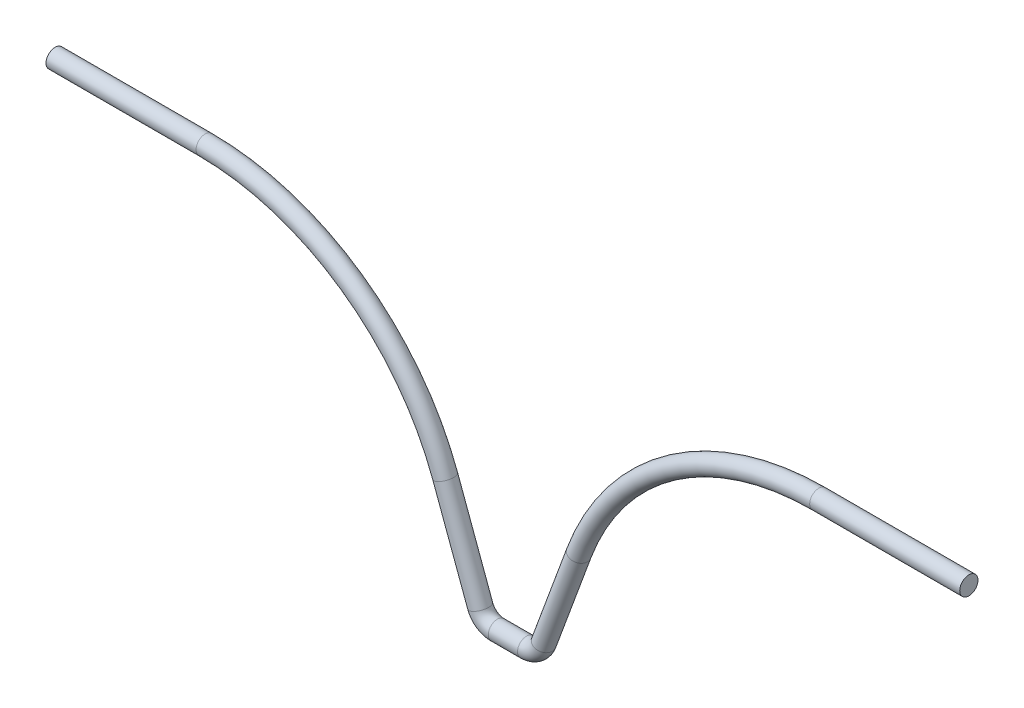
ISO-10303-21;
HEADER;
FILE_DESCRIPTION(('STEP AP214'),'2;1');
FILE_NAME('part.step','',(''),(''),'','','');
FILE_SCHEMA(('AUTOMOTIVE_DESIGN { 1 0 10303 214 1 1 1 1 }'));
ENDSEC;
DATA;
#1=APPLICATION_CONTEXT('core data for automotive mechanical design processes');
#2=APPLICATION_PROTOCOL_DEFINITION('international standard','automotive_design',2000,#1);
#3=PRODUCT_CONTEXT('',#1,'mechanical');
#4=PRODUCT('Part','Part','',(#3));
#5=PRODUCT_RELATED_PRODUCT_CATEGORY('part','',(#4));
#6=PRODUCT_DEFINITION_FORMATION('','',#4);
#7=PRODUCT_DEFINITION_CONTEXT('part definition',#1,'design');
#8=PRODUCT_DEFINITION('design','',#6,#7);
#9=PRODUCT_DEFINITION_SHAPE('','',#8);
#10=(LENGTH_UNIT() NAMED_UNIT(*) SI_UNIT(.MILLI.,.METRE.));
#11=(NAMED_UNIT(*) PLANE_ANGLE_UNIT() SI_UNIT($,.RADIAN.));
#12=(NAMED_UNIT(*) SI_UNIT($,.STERADIAN.) SOLID_ANGLE_UNIT());
#13=UNCERTAINTY_MEASURE_WITH_UNIT(LENGTH_MEASURE(1.E-05),#10,'distance_accuracy_value','');
#14=(GEOMETRIC_REPRESENTATION_CONTEXT(3) GLOBAL_UNCERTAINTY_ASSIGNED_CONTEXT((#13)) GLOBAL_UNIT_ASSIGNED_CONTEXT((#10,
#11,#12)) REPRESENTATION_CONTEXT('',''));
#15=CARTESIAN_POINT('',(0.,0.,0.));
#16=DIRECTION('',(0.,0.,1.));
#17=DIRECTION('',(1.,0.,0.));
#18=AXIS2_PLACEMENT_3D('',#15,#16,#17);
#19=CARTESIAN_POINT('',(-125.,144.352990963875,0.));
#20=DIRECTION('',(-1.,0.,0.));
#21=DIRECTION('',(0.,0.,1.));
#22=AXIS2_PLACEMENT_3D('',#19,#20,#21);
#23=PLANE('',#22);
#24=CARTESIAN_POINT('',(-125.,144.352990963875,0.));
#25=DIRECTION('',(-1.,0.,0.));
#26=DIRECTION('',(0.,0.,1.));
#27=AXIS2_PLACEMENT_3D('',#24,#25,#26);
#28=CIRCLE('',#27,2.5);
#29=CARTESIAN_POINT('',(-125.,144.352990963875,2.5));
#30=VERTEX_POINT('',#29);
#31=EDGE_CURVE('E83',#30,#30,#28,.T.);
#32=ORIENTED_EDGE('',*,*,#31,.T.);
#33=EDGE_LOOP('',(#32));
#34=FACE_BOUND('',#33,.T.);
#35=ADVANCED_FACE('F49',(#34),#23,.T.);
#36=CARTESIAN_POINT('',(125.,144.352990963875,0.));
#37=DIRECTION('',(-1.,0.,0.));
#38=DIRECTION('',(0.,0.,1.));
#39=AXIS2_PLACEMENT_3D('',#36,#37,#38);
#40=PLANE('',#39);
#41=CARTESIAN_POINT('',(125.,144.352990963875,0.));
#42=DIRECTION('',(-1.,0.,0.));
#43=DIRECTION('',(0.,0.,1.));
#44=AXIS2_PLACEMENT_3D('',#41,#42,#43);
#45=CIRCLE('',#44,2.5);
#46=CARTESIAN_POINT('',(125.,144.352990963875,2.5));
#47=VERTEX_POINT('',#46);
#48=EDGE_CURVE('E11',#47,#47,#45,.T.);
#49=ORIENTED_EDGE('',*,*,#48,.F.);
#50=EDGE_LOOP('',(#49));
#51=FACE_BOUND('',#50,.T.);
#52=ADVANCED_FACE('F91',(#51),#40,.F.);
#53=CARTESIAN_POINT('',(-125.,144.352990963875,0.));
#54=DIRECTION('',(1.,0.,0.));
#55=DIRECTION('',(0.,0.,-1.));
#56=AXIS2_PLACEMENT_3D('',#53,#54,#55);
#57=CYLINDRICAL_SURFACE('',#56,2.5);
#58=CARTESIAN_POINT('',(-83.9459778186671,144.352990963875,0.));
#59=DIRECTION('',(-1.,0.,0.));
#60=DIRECTION('',(0.,0.,1.));
#61=AXIS2_PLACEMENT_3D('',#58,#59,#60);
#62=CIRCLE('',#61,2.5);
#63=CARTESIAN_POINT('',(-83.9459778186671,146.852990963875,0.));
#64=VERTEX_POINT('',#63);
#65=EDGE_CURVE('E80',#64,#64,#62,.T.);
#66=ORIENTED_EDGE('',*,*,#65,.T.);
#67=EDGE_LOOP('',(#66));
#68=FACE_BOUND('',#67,.T.);
#69=ORIENTED_EDGE('',*,*,#31,.F.);
#70=EDGE_LOOP('',(#69));
#71=FACE_BOUND('',#70,.T.);
#72=ADVANCED_FACE('F88',(#68,#71),#57,.T.);
#73=CARTESIAN_POINT('',(-83.9459778186671,74.3529909638754,0.));
#74=DIRECTION('',(0.,0.,-1.));
#75=DIRECTION('',(-1.,0.,0.));
#76=AXIS2_PLACEMENT_3D('',#73,#74,#75);
#77=TOROIDAL_SURFACE('',#76,70.,2.5);
#78=CARTESIAN_POINT('',(-18.2766328028615,98.5921560731584,0.));
#79=DIRECTION('',(-0.346273787275471,0.938133500225795,0.));
#80=DIRECTION('',(0.,0.,1.));
#81=AXIS2_PLACEMENT_3D('',#78,#79,#80);
#82=CIRCLE('',#81,2.5);
#83=CARTESIAN_POINT('',(-15.931299052297,99.457840541347,0.));
#84=VERTEX_POINT('',#83);
#85=EDGE_CURVE('E77',#84,#84,#82,.T.);
#86=CARTESIAN_POINT('',(-83.9459778186671,74.3529909638754,0.));
#87=DIRECTION('',(0.,0.,-1.));
#88=DIRECTION('',(-1.,0.,0.));
#89=AXIS2_PLACEMENT_3D('',#86,#87,#88);
#90=CIRCLE('',#89,72.5);
#91=EDGE_CURVE('',#64,#84,#90,.T.);
#92=ORIENTED_EDGE('',*,*,#65,.F.);
#93=ORIENTED_EDGE('',*,*,#85,.T.);
#94=ORIENTED_EDGE('',*,*,#91,.T.);
#95=ORIENTED_EDGE('',*,*,#91,.F.);
#96=EDGE_LOOP('',(#92,#94,#93,#95));
#97=FACE_BOUND('',#96,.T.);
#98=ADVANCED_FACE('F90',(#97),#77,.T.);
#99=CARTESIAN_POINT('',(-18.2766328028615,98.5921560731584,0.));
#100=DIRECTION('',(0.34627378727547,-0.938133500225795,0.));
#101=DIRECTION('',(0.938133500225795,0.34627378727547,0.));
#102=AXIS2_PLACEMENT_3D('',#99,#100,#101);
#103=CYLINDRICAL_SURFACE('',#102,2.5);
#104=CARTESIAN_POINT('',(-8.69066750112898,72.6216220274981,0.));
#105=DIRECTION('',(-0.346273787275471,0.938133500225795,0.));
#106=DIRECTION('',(0.,0.,1.));
#107=AXIS2_PLACEMENT_3D('',#104,#105,#106);
#108=CIRCLE('',#107,2.5);
#109=CARTESIAN_POINT('',(-11.0360012516935,71.7559375593094,0.));
#110=VERTEX_POINT('',#109);
#111=EDGE_CURVE('E74',#110,#110,#108,.T.);
#112=ORIENTED_EDGE('',*,*,#111,.T.);
#113=EDGE_LOOP('',(#112));
#114=FACE_BOUND('',#113,.T.);
#115=ORIENTED_EDGE('',*,*,#85,.F.);
#116=EDGE_LOOP('',(#115));
#117=FACE_BOUND('',#116,.T.);
#118=ADVANCED_FACE('F98',(#114,#117),#103,.T.);
#119=CARTESIAN_POINT('',(-4.,74.3529909638755,0.));
#120=DIRECTION('',(0.,0.,1.));
#121=DIRECTION('',(1.,0.,0.));
#122=AXIS2_PLACEMENT_3D('',#119,#120,#121);
#123=TOROIDAL_SURFACE('',#122,5.00000000000001,2.5);
#124=CARTESIAN_POINT('',(-3.99999999999998,69.3529909638754,0.));
#125=DIRECTION('',(-1.,0.,0.));
#126=DIRECTION('',(0.,0.,1.));
#127=AXIS2_PLACEMENT_3D('',#124,#125,#126);
#128=CIRCLE('',#127,2.5);
#129=CARTESIAN_POINT('',(-3.99999999999996,66.8529909638755,0.));
#130=VERTEX_POINT('',#129);
#131=EDGE_CURVE('E71',#130,#130,#128,.T.);
#132=CARTESIAN_POINT('',(-4.,74.3529909638755,0.));
#133=DIRECTION('',(0.,0.,1.));
#134=DIRECTION('',(1.,0.,0.));
#135=AXIS2_PLACEMENT_3D('',#132,#133,#134);
#136=CIRCLE('',#135,7.50000000000001);
#137=EDGE_CURVE('',#110,#130,#136,.T.);
#138=ORIENTED_EDGE('',*,*,#111,.F.);
#139=ORIENTED_EDGE('',*,*,#131,.T.);
#140=ORIENTED_EDGE('',*,*,#137,.T.);
#141=ORIENTED_EDGE('',*,*,#137,.F.);
#142=EDGE_LOOP('',(#138,#140,#139,#141));
#143=FACE_BOUND('',#142,.T.);
#144=ADVANCED_FACE('F123',(#143),#123,.T.);
#145=CARTESIAN_POINT('',(-4.,69.3529909638755,0.));
#146=DIRECTION('',(1.,0.,0.));
#147=DIRECTION('',(0.,0.,-1.));
#148=AXIS2_PLACEMENT_3D('',#145,#146,#147);
#149=CYLINDRICAL_SURFACE('',#148,2.5);
#150=CARTESIAN_POINT('',(4.,69.3529909638755,0.));
#151=DIRECTION('',(-1.,0.,0.));
#152=DIRECTION('',(0.,0.,1.));
#153=AXIS2_PLACEMENT_3D('',#150,#151,#152);
#154=CIRCLE('',#153,2.5);
#155=CARTESIAN_POINT('',(4.00000000000001,66.8529909638755,0.));
#156=VERTEX_POINT('',#155);
#157=EDGE_CURVE('E68',#156,#156,#154,.T.);
#158=ORIENTED_EDGE('',*,*,#157,.T.);
#159=EDGE_LOOP('',(#158));
#160=FACE_BOUND('',#159,.T.);
#161=ORIENTED_EDGE('',*,*,#131,.F.);
#162=EDGE_LOOP('',(#161));
#163=FACE_BOUND('',#162,.T.);
#164=ADVANCED_FACE('F119',(#160,#163),#149,.T.);
#165=CARTESIAN_POINT('',(4.,74.3529909638755,0.));
#166=DIRECTION('',(0.,0.,1.));
#167=DIRECTION('',(1.,0.,0.));
#168=AXIS2_PLACEMENT_3D('',#165,#166,#167);
#169=TOROIDAL_SURFACE('',#168,4.99999999999998,2.5);
#170=CARTESIAN_POINT('',(8.69066750112898,72.6216220274981,0.));
#171=DIRECTION('',(-0.34627378727547,-0.938133500225796,0.));
#172=DIRECTION('',(0.,0.,1.));
#173=AXIS2_PLACEMENT_3D('',#170,#171,#172);
#174=CIRCLE('',#173,2.5);
#175=CARTESIAN_POINT('',(11.0360012516934,71.7559375593095,0.));
#176=VERTEX_POINT('',#175);
#177=EDGE_CURVE('E63',#176,#176,#174,.T.);
#178=CARTESIAN_POINT('',(4.,74.3529909638755,0.));
#179=DIRECTION('',(0.,0.,1.));
#180=DIRECTION('',(1.,0.,0.));
#181=AXIS2_PLACEMENT_3D('',#178,#179,#180);
#182=CIRCLE('',#181,7.49999999999998);
#183=EDGE_CURVE('',#156,#176,#182,.T.);
#184=ORIENTED_EDGE('',*,*,#157,.F.);
#185=ORIENTED_EDGE('',*,*,#177,.T.);
#186=ORIENTED_EDGE('',*,*,#183,.T.);
#187=ORIENTED_EDGE('',*,*,#183,.F.);
#188=EDGE_LOOP('',(#184,#186,#185,#187));
#189=FACE_BOUND('',#188,.T.);
#190=ADVANCED_FACE('F115',(#189),#169,.T.);
#191=CARTESIAN_POINT('',(8.69066750112897,72.6216220274981,0.));
#192=DIRECTION('',(0.34627378727547,0.938133500225795,0.));
#193=DIRECTION('',(-0.938133500225795,0.34627378727547,0.));
#194=AXIS2_PLACEMENT_3D('',#191,#192,#193);
#195=CYLINDRICAL_SURFACE('',#194,2.5);
#196=CARTESIAN_POINT('',(18.2766328028615,98.5921560731584,0.));
#197=DIRECTION('',(-0.346273787275471,-0.938133500225795,0.));
#198=DIRECTION('',(0.,0.,1.));
#199=AXIS2_PLACEMENT_3D('',#196,#197,#198);
#200=CIRCLE('',#199,2.5);
#201=CARTESIAN_POINT('',(15.931299052297,99.4578405413471,0.));
#202=VERTEX_POINT('',#201);
#203=EDGE_CURVE('E59',#202,#202,#200,.T.);
#204=ORIENTED_EDGE('',*,*,#203,.T.);
#205=EDGE_LOOP('',(#204));
#206=FACE_BOUND('',#205,.T.);
#207=ORIENTED_EDGE('',*,*,#177,.F.);
#208=EDGE_LOOP('',(#207));
#209=FACE_BOUND('',#208,.T.);
#210=ADVANCED_FACE('F109',(#206,#209),#195,.T.);
#211=CARTESIAN_POINT('',(83.9459778186671,74.3529909638754,0.));
#212=DIRECTION('',(0.,0.,-1.));
#213=DIRECTION('',(-1.,0.,0.));
#214=AXIS2_PLACEMENT_3D('',#211,#212,#213);
#215=TOROIDAL_SURFACE('',#214,70.,2.5);
#216=CARTESIAN_POINT('',(83.9459778186671,144.352990963875,0.));
#217=DIRECTION('',(-1.,0.,0.));
#218=DIRECTION('',(0.,0.,1.));
#219=AXIS2_PLACEMENT_3D('',#216,#217,#218);
#220=CIRCLE('',#219,2.5);
#221=CARTESIAN_POINT('',(83.9459778186671,146.852990963875,0.));
#222=VERTEX_POINT('',#221);
#223=EDGE_CURVE('E55',#222,#222,#220,.T.);
#224=CARTESIAN_POINT('',(83.9459778186671,74.3529909638754,0.));
#225=DIRECTION('',(0.,0.,-1.));
#226=DIRECTION('',(-1.,0.,0.));
#227=AXIS2_PLACEMENT_3D('',#224,#225,#226);
#228=CIRCLE('',#227,72.5);
#229=EDGE_CURVE('',#202,#222,#228,.T.);
#230=ORIENTED_EDGE('',*,*,#203,.F.);
#231=ORIENTED_EDGE('',*,*,#223,.T.);
#232=ORIENTED_EDGE('',*,*,#229,.T.);
#233=ORIENTED_EDGE('',*,*,#229,.F.);
#234=EDGE_LOOP('',(#230,#232,#231,#233));
#235=FACE_BOUND('',#234,.T.);
#236=ADVANCED_FACE('F104',(#235),#215,.T.);
#237=CARTESIAN_POINT('',(83.9459778186672,144.352990963875,0.));
#238=DIRECTION('',(1.,0.,0.));
#239=DIRECTION('',(0.,0.,-1.));
#240=AXIS2_PLACEMENT_3D('',#237,#238,#239);
#241=CYLINDRICAL_SURFACE('',#240,2.5);
#242=ORIENTED_EDGE('',*,*,#48,.T.);
#243=EDGE_LOOP('',(#242));
#244=FACE_BOUND('',#243,.T.);
#245=ORIENTED_EDGE('',*,*,#223,.F.);
#246=EDGE_LOOP('',(#245));
#247=FACE_BOUND('',#246,.T.);
#248=ADVANCED_FACE('F102',(#244,#247),#241,.T.);
#249=CLOSED_SHELL('',(#35,#52,#72,#98,#118,#144,#164,#190,#210,#236,#248));
#250=MANIFOLD_SOLID_BREP('B2',#249);
#251=ADVANCED_BREP_SHAPE_REPRESENTATION('',(#18,#250),#14);
#252=SHAPE_DEFINITION_REPRESENTATION(#9,#251);
ENDSEC;
END-ISO-10303-21;
